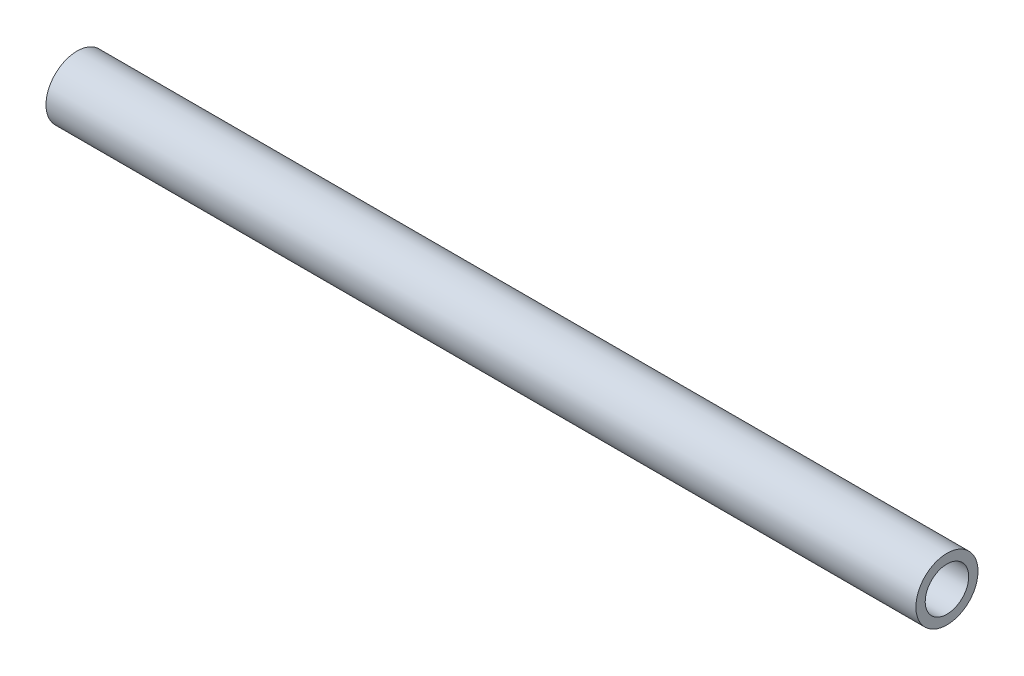
ISO-10303-21;
HEADER;
FILE_DESCRIPTION(('STEP AP214'),'2;1');
FILE_NAME('part.step','',(''),(''),'','','');
FILE_SCHEMA(('AUTOMOTIVE_DESIGN { 1 0 10303 214 1 1 1 1 }'));
ENDSEC;
DATA;
#1=APPLICATION_CONTEXT('core data for automotive mechanical design processes');
#2=APPLICATION_PROTOCOL_DEFINITION('international standard','automotive_design',2000,#1);
#3=PRODUCT_CONTEXT('',#1,'mechanical');
#4=PRODUCT('Part','Part','',(#3));
#5=PRODUCT_RELATED_PRODUCT_CATEGORY('part','',(#4));
#6=PRODUCT_DEFINITION_FORMATION('','',#4);
#7=PRODUCT_DEFINITION_CONTEXT('part definition',#1,'design');
#8=PRODUCT_DEFINITION('design','',#6,#7);
#9=PRODUCT_DEFINITION_SHAPE('','',#8);
#10=(LENGTH_UNIT() NAMED_UNIT(*) SI_UNIT(.MILLI.,.METRE.));
#11=(NAMED_UNIT(*) PLANE_ANGLE_UNIT() SI_UNIT($,.RADIAN.));
#12=(NAMED_UNIT(*) SI_UNIT($,.STERADIAN.) SOLID_ANGLE_UNIT());
#13=UNCERTAINTY_MEASURE_WITH_UNIT(LENGTH_MEASURE(1.E-05),#10,'distance_accuracy_value','');
#14=(GEOMETRIC_REPRESENTATION_CONTEXT(3) GLOBAL_UNCERTAINTY_ASSIGNED_CONTEXT((#13)) GLOBAL_UNIT_ASSIGNED_CONTEXT((#10,
#11,#12)) REPRESENTATION_CONTEXT('',''));
#15=CARTESIAN_POINT('',(0.,0.,0.));
#16=DIRECTION('',(0.,0.,1.));
#17=DIRECTION('',(1.,0.,0.));
#18=AXIS2_PLACEMENT_3D('',#15,#16,#17);
#19=CARTESIAN_POINT('',(-70.,0.,0.));
#20=DIRECTION('',(1.,0.,0.));
#21=DIRECTION('',(0.,1.,0.));
#22=AXIS2_PLACEMENT_3D('',#19,#20,#21);
#23=PLANE('',#22);
#24=CARTESIAN_POINT('',(-70.,0.,0.));
#25=DIRECTION('',(1.,0.,0.));
#26=DIRECTION('',(0.,1.,0.));
#27=AXIS2_PLACEMENT_3D('',#24,#25,#26);
#28=CIRCLE('',#27,3.5);
#29=CARTESIAN_POINT('',(-70.,3.5,0.));
#30=VERTEX_POINT('',#29);
#31=EDGE_CURVE('E65',#30,#30,#28,.T.);
#32=ORIENTED_EDGE('',*,*,#31,.T.);
#33=EDGE_LOOP('',(#32));
#34=FACE_BOUND('',#33,.T.);
#35=CARTESIAN_POINT('',(-70.,0.,0.));
#36=DIRECTION('',(1.,0.,0.));
#37=DIRECTION('',(0.,1.,0.));
#38=AXIS2_PLACEMENT_3D('',#35,#36,#37);
#39=CIRCLE('',#38,5.);
#40=CARTESIAN_POINT('',(-70.,5.,0.));
#41=VERTEX_POINT('',#40);
#42=EDGE_CURVE('E57',#41,#41,#39,.T.);
#43=ORIENTED_EDGE('',*,*,#42,.F.);
#44=EDGE_LOOP('',(#43));
#45=FACE_BOUND('',#44,.T.);
#46=ADVANCED_FACE('F51',(#34,#45),#23,.F.);
#47=CARTESIAN_POINT('',(70.,0.,0.));
#48=DIRECTION('',(1.,0.,0.));
#49=DIRECTION('',(0.,1.,0.));
#50=AXIS2_PLACEMENT_3D('',#47,#48,#49);
#51=PLANE('',#50);
#52=CARTESIAN_POINT('',(70.,0.,0.));
#53=DIRECTION('',(1.,0.,0.));
#54=DIRECTION('',(0.,1.,0.));
#55=AXIS2_PLACEMENT_3D('',#52,#53,#54);
#56=CIRCLE('',#55,3.5);
#57=CARTESIAN_POINT('',(70.,3.50000000000003,0.));
#58=VERTEX_POINT('',#57);
#59=EDGE_CURVE('E61',#58,#58,#56,.T.);
#60=ORIENTED_EDGE('',*,*,#59,.F.);
#61=EDGE_LOOP('',(#60));
#62=FACE_BOUND('',#61,.T.);
#63=CARTESIAN_POINT('',(70.,0.,0.));
#64=DIRECTION('',(1.,0.,0.));
#65=DIRECTION('',(0.,1.,0.));
#66=AXIS2_PLACEMENT_3D('',#63,#64,#65);
#67=CIRCLE('',#66,5.);
#68=CARTESIAN_POINT('',(70.,5.00000000000003,0.));
#69=VERTEX_POINT('',#68);
#70=EDGE_CURVE('E11',#69,#69,#67,.T.);
#71=ORIENTED_EDGE('',*,*,#70,.T.);
#72=EDGE_LOOP('',(#71));
#73=FACE_BOUND('',#72,.T.);
#74=ADVANCED_FACE('F81',(#62,#73),#51,.T.);
#75=CARTESIAN_POINT('',(-70.,0.,0.));
#76=DIRECTION('',(1.,0.,0.));
#77=DIRECTION('',(0.,1.,0.));
#78=AXIS2_PLACEMENT_3D('',#75,#76,#77);
#79=CYLINDRICAL_SURFACE('',#78,5.);
#80=ORIENTED_EDGE('',*,*,#70,.F.);
#81=EDGE_LOOP('',(#80));
#82=FACE_BOUND('',#81,.T.);
#83=ORIENTED_EDGE('',*,*,#42,.T.);
#84=EDGE_LOOP('',(#83));
#85=FACE_BOUND('',#84,.T.);
#86=ADVANCED_FACE('F75',(#82,#85),#79,.T.);
#87=CARTESIAN_POINT('',(-70.,0.,0.));
#88=DIRECTION('',(1.,0.,0.));
#89=DIRECTION('',(0.,1.,0.));
#90=AXIS2_PLACEMENT_3D('',#87,#88,#89);
#91=CYLINDRICAL_SURFACE('',#90,3.5);
#92=ORIENTED_EDGE('',*,*,#59,.T.);
#93=EDGE_LOOP('',(#92));
#94=FACE_BOUND('',#93,.T.);
#95=ORIENTED_EDGE('',*,*,#31,.F.);
#96=EDGE_LOOP('',(#95));
#97=FACE_BOUND('',#96,.T.);
#98=ADVANCED_FACE('F73',(#94,#97),#91,.F.);
#99=CLOSED_SHELL('',(#46,#74,#86,#98));
#100=MANIFOLD_SOLID_BREP('B2',#99);
#101=ADVANCED_BREP_SHAPE_REPRESENTATION('',(#18,#100),#14);
#102=SHAPE_DEFINITION_REPRESENTATION(#9,#101);
ENDSEC;
END-ISO-10303-21;
